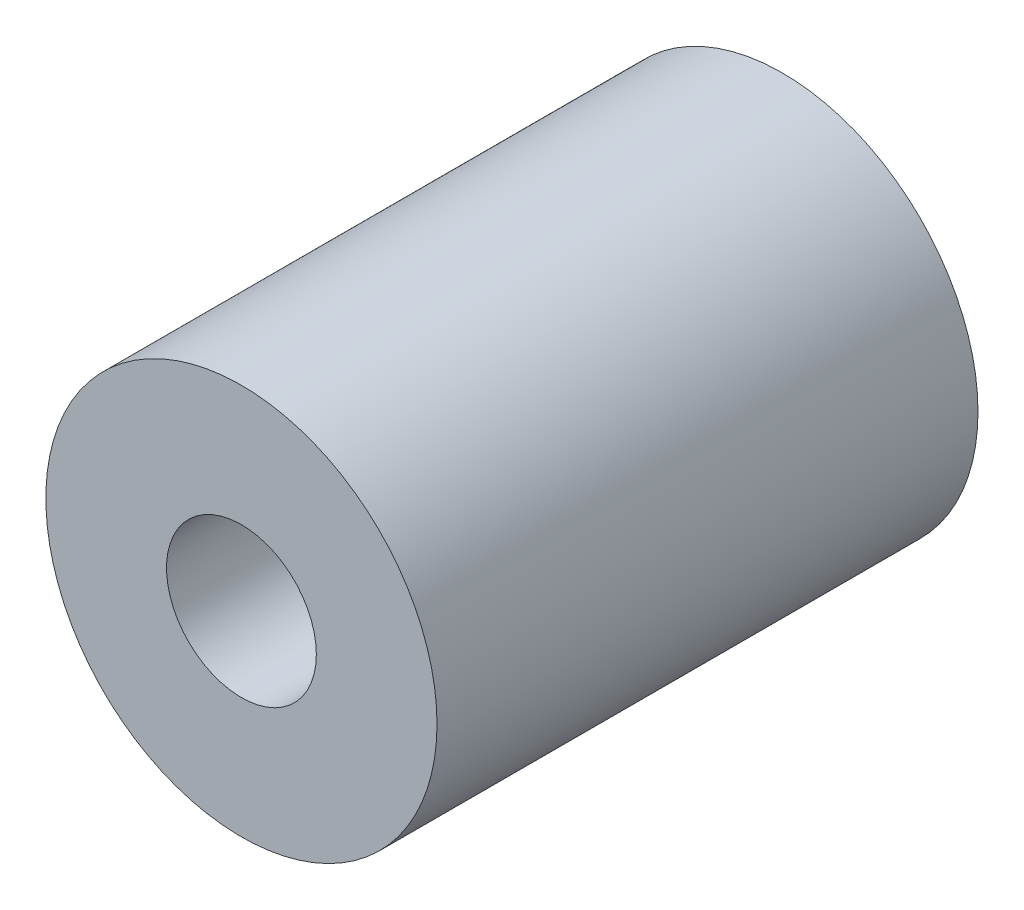
ISO-10303-21;
HEADER;
FILE_DESCRIPTION(('STEP AP214'),'2;1');
FILE_NAME('part.step','',(''),(''),'','','');
FILE_SCHEMA(('AUTOMOTIVE_DESIGN { 1 0 10303 214 1 1 1 1 }'));
ENDSEC;
DATA;
#1=APPLICATION_CONTEXT('core data for automotive mechanical design processes');
#2=APPLICATION_PROTOCOL_DEFINITION('international standard','automotive_design',2000,#1);
#3=PRODUCT_CONTEXT('',#1,'mechanical');
#4=PRODUCT('Part','Part','',(#3));
#5=PRODUCT_RELATED_PRODUCT_CATEGORY('part','',(#4));
#6=PRODUCT_DEFINITION_FORMATION('','',#4);
#7=PRODUCT_DEFINITION_CONTEXT('part definition',#1,'design');
#8=PRODUCT_DEFINITION('design','',#6,#7);
#9=PRODUCT_DEFINITION_SHAPE('','',#8);
#10=(LENGTH_UNIT() NAMED_UNIT(*) SI_UNIT(.MILLI.,.METRE.));
#11=(NAMED_UNIT(*) PLANE_ANGLE_UNIT() SI_UNIT($,.RADIAN.));
#12=(NAMED_UNIT(*) SI_UNIT($,.STERADIAN.) SOLID_ANGLE_UNIT());
#13=UNCERTAINTY_MEASURE_WITH_UNIT(LENGTH_MEASURE(1.E-05),#10,'distance_accuracy_value','');
#14=(GEOMETRIC_REPRESENTATION_CONTEXT(3) GLOBAL_UNCERTAINTY_ASSIGNED_CONTEXT((#13)) GLOBAL_UNIT_ASSIGNED_CONTEXT((#10,
#11,#12)) REPRESENTATION_CONTEXT('',''));
#15=CARTESIAN_POINT('',(0.,0.,0.));
#16=DIRECTION('',(0.,0.,1.));
#17=DIRECTION('',(1.,0.,0.));
#18=AXIS2_PLACEMENT_3D('',#15,#16,#17);
#19=CARTESIAN_POINT('',(0.,0.,-25.4));
#20=DIRECTION('',(0.,0.,1.));
#21=DIRECTION('',(1.,0.,0.));
#22=AXIS2_PLACEMENT_3D('',#19,#20,#21);
#23=CYLINDRICAL_SURFACE('',#22,18.7328227761894);
#24=CARTESIAN_POINT('',(0.,0.,-25.4));
#25=DIRECTION('',(0.,0.,1.));
#26=DIRECTION('',(1.,0.,0.));
#27=AXIS2_PLACEMENT_3D('',#24,#25,#26);
#28=CIRCLE('',#27,18.7328227761894);
#29=CARTESIAN_POINT('',(18.7328227761894,0.,-25.4));
#30=VERTEX_POINT('',#29);
#31=EDGE_CURVE('E10',#30,#30,#28,.T.);
#32=ORIENTED_EDGE('',*,*,#31,.T.);
#33=EDGE_LOOP('',(#32));
#34=FACE_BOUND('',#33,.T.);
#35=CARTESIAN_POINT('',(0.,0.,26.416));
#36=DIRECTION('',(0.,0.,1.));
#37=DIRECTION('',(1.,0.,0.));
#38=AXIS2_PLACEMENT_3D('',#35,#36,#37);
#39=CIRCLE('',#38,18.7328227761894);
#40=CARTESIAN_POINT('',(18.7328227761894,0.,26.416));
#41=VERTEX_POINT('',#40);
#42=EDGE_CURVE('E44',#41,#41,#39,.T.);
#43=ORIENTED_EDGE('',*,*,#42,.F.);
#44=EDGE_LOOP('',(#43));
#45=FACE_BOUND('',#44,.T.);
#46=ADVANCED_FACE('F37',(#34,#45),#23,.T.);
#47=CARTESIAN_POINT('',(0.,0.,-25.4));
#48=DIRECTION('',(0.,0.,1.));
#49=DIRECTION('',(1.,0.,0.));
#50=AXIS2_PLACEMENT_3D('',#47,#48,#49);
#51=PLANE('',#50);
#52=CARTESIAN_POINT('',(0.,0.,-25.4));
#53=DIRECTION('',(0.,0.,1.));
#54=DIRECTION('',(1.,0.,0.));
#55=AXIS2_PLACEMENT_3D('',#52,#53,#54);
#56=CIRCLE('',#55,7.17496066779787);
#57=CARTESIAN_POINT('',(7.17496066779787,0.,-25.4));
#58=VERTEX_POINT('',#57);
#59=EDGE_CURVE('E49',#58,#58,#56,.T.);
#60=ORIENTED_EDGE('',*,*,#59,.T.);
#61=EDGE_LOOP('',(#60));
#62=FACE_BOUND('',#61,.T.);
#63=ORIENTED_EDGE('',*,*,#31,.F.);
#64=EDGE_LOOP('',(#63));
#65=FACE_BOUND('',#64,.T.);
#66=ADVANCED_FACE('F66',(#62,#65),#51,.F.);
#67=CARTESIAN_POINT('',(0.,0.,26.416));
#68=DIRECTION('',(0.,0.,1.));
#69=DIRECTION('',(1.,0.,0.));
#70=AXIS2_PLACEMENT_3D('',#67,#68,#69);
#71=PLANE('',#70);
#72=CARTESIAN_POINT('',(0.,0.,26.416));
#73=DIRECTION('',(0.,0.,1.));
#74=DIRECTION('',(1.,0.,0.));
#75=AXIS2_PLACEMENT_3D('',#72,#73,#74);
#76=CIRCLE('',#75,7.17496066779787);
#77=CARTESIAN_POINT('',(7.17496066779787,0.,26.416));
#78=VERTEX_POINT('',#77);
#79=EDGE_CURVE('E54',#78,#78,#76,.T.);
#80=ORIENTED_EDGE('',*,*,#79,.F.);
#81=EDGE_LOOP('',(#80));
#82=FACE_BOUND('',#81,.T.);
#83=ORIENTED_EDGE('',*,*,#42,.T.);
#84=EDGE_LOOP('',(#83));
#85=FACE_BOUND('',#84,.T.);
#86=ADVANCED_FACE('F64',(#82,#85),#71,.T.);
#87=CARTESIAN_POINT('',(0.,0.,-165.608));
#88=DIRECTION('',(0.,0.,1.));
#89=DIRECTION('',(1.,0.,0.));
#90=AXIS2_PLACEMENT_3D('',#87,#88,#89);
#91=CYLINDRICAL_SURFACE('',#90,7.17496066779787);
#92=CARTESIAN_POINT('',(7.17496066779787,0.,26.416));
#93=CARTESIAN_POINT('',(7.17496066779787,0.,25.87625));
#94=CARTESIAN_POINT('',(7.17496066779787,0.,25.3365));
#95=CARTESIAN_POINT('',(7.17496066779787,0.,24.257));
#96=CARTESIAN_POINT('',(7.17496066779787,0.,23.71725));
#97=CARTESIAN_POINT('',(7.17496066779787,0.,22.63775));
#98=CARTESIAN_POINT('',(7.17496066779787,0.,22.098));
#99=CARTESIAN_POINT('',(7.17496066779787,0.,21.0185));
#100=CARTESIAN_POINT('',(7.17496066779787,0.,20.47875));
#101=CARTESIAN_POINT('',(7.17496066779787,0.,19.39925));
#102=CARTESIAN_POINT('',(7.17496066779787,0.,18.8595));
#103=CARTESIAN_POINT('',(7.17496066779787,0.,17.78));
#104=CARTESIAN_POINT('',(7.17496066779787,0.,17.24025));
#105=CARTESIAN_POINT('',(7.17496066779787,0.,16.16075));
#106=CARTESIAN_POINT('',(7.17496066779787,0.,15.621));
#107=CARTESIAN_POINT('',(7.17496066779787,0.,14.5415));
#108=CARTESIAN_POINT('',(7.17496066779787,0.,14.00175));
#109=CARTESIAN_POINT('',(7.17496066779787,0.,12.92225));
#110=CARTESIAN_POINT('',(7.17496066779787,0.,12.3825));
#111=CARTESIAN_POINT('',(7.17496066779787,0.,11.303));
#112=CARTESIAN_POINT('',(7.17496066779787,0.,10.76325));
#113=CARTESIAN_POINT('',(7.17496066779787,0.,9.68375000000002));
#114=CARTESIAN_POINT('',(7.17496066779787,0.,9.14400000000001));
#115=CARTESIAN_POINT('',(7.17496066779787,0.,8.06450000000001));
#116=CARTESIAN_POINT('',(7.17496066779787,0.,7.52475000000002));
#117=CARTESIAN_POINT('',(7.17496066779787,0.,6.44525000000001));
#118=CARTESIAN_POINT('',(7.17496066779787,0.,5.90550000000001));
#119=CARTESIAN_POINT('',(7.17496066779787,0.,4.82600000000001));
#120=CARTESIAN_POINT('',(7.17496066779787,0.,4.28625000000001));
#121=CARTESIAN_POINT('',(7.17496066779787,0.,3.20675000000001));
#122=CARTESIAN_POINT('',(7.17496066779787,0.,2.667));
#123=CARTESIAN_POINT('',(7.17496066779787,0.,1.5875));
#124=CARTESIAN_POINT('',(7.17496066779787,0.,1.04775));
#125=CARTESIAN_POINT('',(7.17496066779787,0.,-0.0317499999999876));
#126=CARTESIAN_POINT('',(7.17496066779787,0.,-0.571499999999984));
#127=CARTESIAN_POINT('',(7.17496066779787,0.,-1.65099999999999));
#128=CARTESIAN_POINT('',(7.17496066779787,0.,-2.19074999999999));
#129=CARTESIAN_POINT('',(7.17496066779787,0.,-3.27024999999999));
#130=CARTESIAN_POINT('',(7.17496066779787,0.,-3.80999999999999));
#131=CARTESIAN_POINT('',(7.17496066779787,0.,-4.88949999999999));
#132=CARTESIAN_POINT('',(7.17496066779787,0.,-5.42925));
#133=CARTESIAN_POINT('',(7.17496066779787,0.,-6.50875));
#134=CARTESIAN_POINT('',(7.17496066779787,0.,-7.04849999999999));
#135=CARTESIAN_POINT('',(7.17496066779787,0.,-8.128));
#136=CARTESIAN_POINT('',(7.17496066779787,0.,-8.66775));
#137=CARTESIAN_POINT('',(7.17496066779787,0.,-9.74725));
#138=CARTESIAN_POINT('',(7.17496066779787,0.,-10.287));
#139=CARTESIAN_POINT('',(7.17496066779787,0.,-11.3665));
#140=CARTESIAN_POINT('',(7.17496066779787,0.,-11.90625));
#141=CARTESIAN_POINT('',(7.17496066779787,0.,-12.98575));
#142=CARTESIAN_POINT('',(7.17496066779787,0.,-13.5255));
#143=CARTESIAN_POINT('',(7.17496066779787,0.,-14.605));
#144=CARTESIAN_POINT('',(7.17496066779787,0.,-15.14475));
#145=CARTESIAN_POINT('',(7.17496066779787,0.,-16.22425));
#146=CARTESIAN_POINT('',(7.17496066779787,0.,-16.764));
#147=CARTESIAN_POINT('',(7.17496066779787,0.,-17.8435));
#148=CARTESIAN_POINT('',(7.17496066779787,0.,-18.38325));
#149=CARTESIAN_POINT('',(7.17496066779787,0.,-19.46275));
#150=CARTESIAN_POINT('',(7.17496066779787,0.,-20.0025));
#151=CARTESIAN_POINT('',(7.17496066779787,0.,-21.082));
#152=CARTESIAN_POINT('',(7.17496066779787,0.,-21.62175));
#153=CARTESIAN_POINT('',(7.17496066779787,0.,-22.70125));
#154=CARTESIAN_POINT('',(7.17496066779787,0.,-23.241));
#155=CARTESIAN_POINT('',(7.17496066779787,0.,-24.3205));
#156=CARTESIAN_POINT('',(7.17496066779787,0.,-24.86025));
#157=CARTESIAN_POINT('',(7.17496066779787,0.,-25.4));
#158=B_SPLINE_CURVE_WITH_KNOTS('',3,(#92,#93,#94,#95,#96,#97,#98,#99,#100,#101,#102,#103,#104,
#105,#106,#107,#108,#109,#110,#111,#112,#113,#114,#115,#116,#117,#118,#119,#120,#121,#122,#123,
#124,#125,#126,#127,#128,#129,#130,#131,#132,#133,#134,#135,#136,#137,#138,#139,#140,#141,#142,
#143,#144,#145,#146,#147,#148,#149,#150,#151,#152,#153,#154,#155,#156,#157),.UNSPECIFIED.,.F.,
.F.,(4,2,2,2,2,2,2,2,2,2,2,2,2,2,2,2,2,2,2,2,2,2,2,2,2,2,2,2,2,2,2,2,4),(0.,1.61924999999999,
3.23850000000001,4.85774999999999,6.47700000000001,8.09625,9.71550000000002,11.33475,12.954,
14.57325,16.1925,17.81175,19.431,21.05025,22.6695,24.28875,25.908,27.52725,29.1465,30.76575,
32.385,34.00425,35.6235,37.24275,38.862,40.48125,42.1005,43.71975,45.339,46.95825,48.5775,
50.19675,51.816),.UNSPECIFIED.);
#159=EDGE_CURVE('BSEAM61',#78,#58,#158,.T.);
#160=ORIENTED_EDGE('',*,*,#79,.T.);
#161=ORIENTED_EDGE('',*,*,#59,.F.);
#162=ORIENTED_EDGE('',*,*,#159,.T.);
#163=ORIENTED_EDGE('',*,*,#159,.F.);
#164=EDGE_LOOP('',(#160,#162,#161,#163));
#165=FACE_BOUND('',#164,.T.);
#166=ADVANCED_FACE('F61',(#165),#91,.F.);
#167=CLOSED_SHELL('',(#46,#66,#86,#166));
#168=MANIFOLD_SOLID_BREP('B2',#167);
#169=ADVANCED_BREP_SHAPE_REPRESENTATION('',(#18,#168),#14);
#170=SHAPE_DEFINITION_REPRESENTATION(#9,#169);
ENDSEC;
END-ISO-10303-21;
